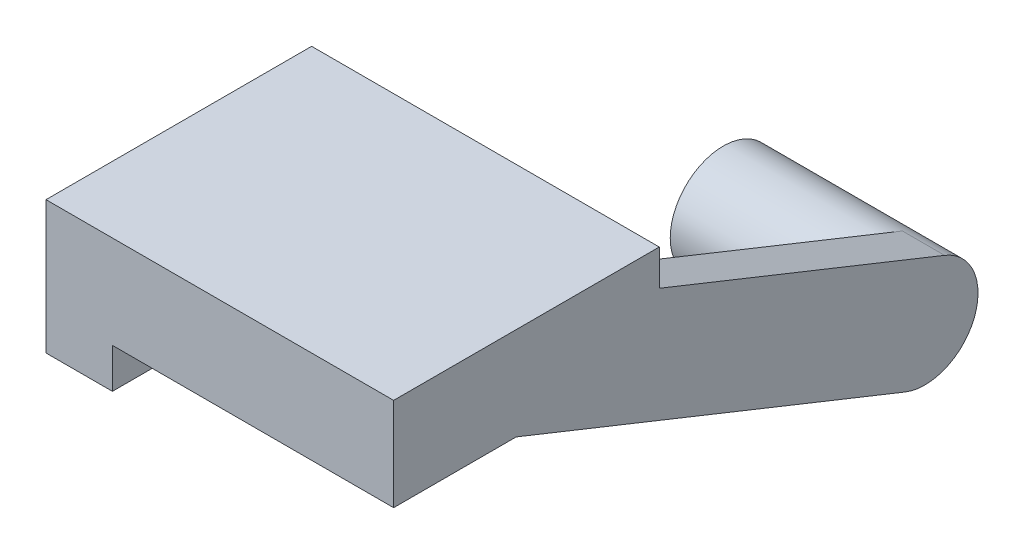
ISO-10303-21;
HEADER;
FILE_DESCRIPTION(('STEP AP214'),'2;1');
FILE_NAME('part.step','',(''),(''),'','','');
FILE_SCHEMA(('AUTOMOTIVE_DESIGN { 1 0 10303 214 1 1 1 1 }'));
ENDSEC;
DATA;
#1=APPLICATION_CONTEXT('core data for automotive mechanical design processes');
#2=APPLICATION_PROTOCOL_DEFINITION('international standard','automotive_design',2000,#1);
#3=PRODUCT_CONTEXT('',#1,'mechanical');
#4=PRODUCT('Part','Part','',(#3));
#5=PRODUCT_RELATED_PRODUCT_CATEGORY('part','',(#4));
#6=PRODUCT_DEFINITION_FORMATION('','',#4);
#7=PRODUCT_DEFINITION_CONTEXT('part definition',#1,'design');
#8=PRODUCT_DEFINITION('design','',#6,#7);
#9=PRODUCT_DEFINITION_SHAPE('','',#8);
#10=(LENGTH_UNIT() NAMED_UNIT(*) SI_UNIT(.MILLI.,.METRE.));
#11=(NAMED_UNIT(*) PLANE_ANGLE_UNIT() SI_UNIT($,.RADIAN.));
#12=(NAMED_UNIT(*) SI_UNIT($,.STERADIAN.) SOLID_ANGLE_UNIT());
#13=UNCERTAINTY_MEASURE_WITH_UNIT(LENGTH_MEASURE(1.E-05),#10,'distance_accuracy_value','');
#14=(GEOMETRIC_REPRESENTATION_CONTEXT(3) GLOBAL_UNCERTAINTY_ASSIGNED_CONTEXT((#13)) GLOBAL_UNIT_ASSIGNED_CONTEXT((#10,
#11,#12)) REPRESENTATION_CONTEXT('',''));
#15=CARTESIAN_POINT('',(0.,0.,0.));
#16=DIRECTION('',(0.,0.,1.));
#17=DIRECTION('',(1.,0.,0.));
#18=AXIS2_PLACEMENT_3D('',#15,#16,#17);
#19=CARTESIAN_POINT('',(23.,0.,0.));
#20=DIRECTION('',(1.,0.,0.));
#21=DIRECTION('',(0.,0.,-1.));
#22=AXIS2_PLACEMENT_3D('',#19,#20,#21);
#23=PLANE('',#22);
#24=CARTESIAN_POINT('',(23.,-9.99999999999999,-30.));
#25=DIRECTION('',(-1.,0.,0.));
#26=DIRECTION('',(0.,0.,1.));
#27=AXIS2_PLACEMENT_3D('',#24,#25,#26);
#28=CIRCLE('',#27,4.);
#29=CARTESIAN_POINT('',(23.,-13.713906763541,-28.5144372945836));
#30=VERTEX_POINT('',#29);
#31=CARTESIAN_POINT('',(23.,-6.28609323645896,-31.4855627054164));
#32=VERTEX_POINT('',#31);
#33=EDGE_CURVE('E143',#30,#32,#28,.T.);
#34=ORIENTED_EDGE('',*,*,#33,.F.);
#35=DIRECTION('',(0.,0.371390676354104,0.928476690885259));
#36=VECTOR('',#35,1.);
#37=CARTESIAN_POINT('',(23.,-1.98976883250655,0.79590753300262));
#38=LINE('',#37,#36);
#39=CARTESIAN_POINT('',(23.,-2.,0.770329614269001));
#40=VERTEX_POINT('',#39);
#41=EDGE_CURVE('E146',#30,#40,#38,.T.);
#42=ORIENTED_EDGE('',*,*,#41,.T.);
#43=DIRECTION('',(0.,0.,-1.));
#44=VECTOR('',#43,1.);
#45=CARTESIAN_POINT('',(23.,-2.,10.));
#46=LINE('',#45,#44);
#47=CARTESIAN_POINT('',(23.,-2.,-10.));
#48=VERTEX_POINT('',#47);
#49=EDGE_CURVE('E74',#40,#48,#46,.T.);
#50=ORIENTED_EDGE('',*,*,#49,.T.);
#51=DIRECTION('',(0.,1.,0.));
#52=VECTOR('',#51,1.);
#53=CARTESIAN_POINT('',(23.,5.,-10.));
#54=LINE('',#53,#52);
#55=CARTESIAN_POINT('',(23.,2.30813184570761,-10.));
#56=VERTEX_POINT('',#55);
#57=EDGE_CURVE('E64',#48,#56,#54,.T.);
#58=ORIENTED_EDGE('',*,*,#57,.T.);
#59=DIRECTION('',(0.,0.371390676354106,0.928476690885259));
#60=VECTOR('',#59,1.);
#61=CARTESIAN_POINT('',(23.,5.43804469457554,-2.17521787783023));
#62=LINE('',#61,#60);
#63=EDGE_CURVE('E147',#32,#56,#62,.T.);
#64=ORIENTED_EDGE('',*,*,#63,.F.);
#65=EDGE_LOOP('',(#34,#42,#50,#58,#64));
#66=FACE_BOUND('',#65,.T.);
#67=ADVANCED_FACE('F45',(#66),#23,.F.);
#68=CARTESIAN_POINT('',(5.,0.,0.));
#69=DIRECTION('',(-1.,0.,0.));
#70=DIRECTION('',(0.,0.,1.));
#71=AXIS2_PLACEMENT_3D('',#68,#69,#70);
#72=PLANE('',#71);
#73=DIRECTION('',(0.,0.,-1.));
#74=VECTOR('',#73,1.);
#75=CARTESIAN_POINT('',(5.,-2.,10.));
#76=LINE('',#75,#74);
#77=CARTESIAN_POINT('',(5.,-2.,10.));
#78=VERTEX_POINT('',#77);
#79=CARTESIAN_POINT('',(5.,-2.,-10.));
#80=VERTEX_POINT('',#79);
#81=EDGE_CURVE('E163',#78,#80,#76,.T.);
#82=ORIENTED_EDGE('',*,*,#81,.F.);
#83=DIRECTION('',(0.,-1.,0.));
#84=VECTOR('',#83,1.);
#85=CARTESIAN_POINT('',(5.,-5.,10.));
#86=LINE('',#85,#84);
#87=CARTESIAN_POINT('',(5.,-5.,10.));
#88=VERTEX_POINT('',#87);
#89=EDGE_CURVE('E224',#78,#88,#86,.T.);
#90=ORIENTED_EDGE('',*,*,#89,.T.);
#91=DIRECTION('',(0.,0.,-1.));
#92=VECTOR('',#91,1.);
#93=CARTESIAN_POINT('',(5.,-5.,10.));
#94=LINE('',#93,#92);
#95=CARTESIAN_POINT('',(5.,-5.,-10.));
#96=VERTEX_POINT('',#95);
#97=EDGE_CURVE('E228',#88,#96,#94,.T.);
#98=ORIENTED_EDGE('',*,*,#97,.T.);
#99=DIRECTION('',(0.,1.,0.));
#100=VECTOR('',#99,1.);
#101=CARTESIAN_POINT('',(5.,-5.,-10.));
#102=LINE('',#101,#100);
#103=EDGE_CURVE('E221',#96,#80,#102,.T.);
#104=ORIENTED_EDGE('',*,*,#103,.T.);
#105=EDGE_LOOP('',(#82,#90,#98,#104));
#106=FACE_BOUND('',#105,.T.);
#107=ADVANCED_FACE('F273',(#106),#72,.F.);
#108=CARTESIAN_POINT('',(0.,0.,0.));
#109=DIRECTION('',(-1.,0.,0.));
#110=DIRECTION('',(0.,0.,1.));
#111=AXIS2_PLACEMENT_3D('',#108,#109,#110);
#112=PLANE('',#111);
#113=CARTESIAN_POINT('',(0.,0.,5.));
#114=DIRECTION('',(1.,0.,0.));
#115=DIRECTION('',(0.,0.,-1.));
#116=AXIS2_PLACEMENT_3D('',#113,#114,#115);
#117=CIRCLE('',#116,1.65);
#118=CARTESIAN_POINT('',(0.,0.,3.35));
#119=VERTEX_POINT('',#118);
#120=EDGE_CURVE('E213',#119,#119,#117,.T.);
#121=ORIENTED_EDGE('',*,*,#120,.T.);
#122=EDGE_LOOP('',(#121));
#123=FACE_BOUND('',#122,.T.);
#124=DIRECTION('',(0.,1.,0.));
#125=VECTOR('',#124,1.);
#126=CARTESIAN_POINT('',(0.,-5.,-10.));
#127=LINE('',#126,#125);
#128=CARTESIAN_POINT('',(0.,-5.,-10.));
#129=VERTEX_POINT('',#128);
#130=CARTESIAN_POINT('',(0.,5.,-10.));
#131=VERTEX_POINT('',#130);
#132=EDGE_CURVE('E220',#129,#131,#127,.T.);
#133=ORIENTED_EDGE('',*,*,#132,.F.);
#134=DIRECTION('',(0.,0.,-1.));
#135=VECTOR('',#134,1.);
#136=CARTESIAN_POINT('',(0.,-5.,10.));
#137=LINE('',#136,#135);
#138=CARTESIAN_POINT('',(0.,-5.,10.));
#139=VERTEX_POINT('',#138);
#140=EDGE_CURVE('E225',#139,#129,#137,.T.);
#141=ORIENTED_EDGE('',*,*,#140,.F.);
#142=DIRECTION('',(0.,-1.,0.));
#143=VECTOR('',#142,1.);
#144=CARTESIAN_POINT('',(0.,-5.,10.));
#145=LINE('',#144,#143);
#146=CARTESIAN_POINT('',(0.,5.,10.));
#147=VERTEX_POINT('',#146);
#148=EDGE_CURVE('E238',#147,#139,#145,.T.);
#149=ORIENTED_EDGE('',*,*,#148,.F.);
#150=DIRECTION('',(0.,0.,1.));
#151=VECTOR('',#150,1.);
#152=CARTESIAN_POINT('',(0.,5.,10.));
#153=LINE('',#152,#151);
#154=EDGE_CURVE('E235',#131,#147,#153,.T.);
#155=ORIENTED_EDGE('',*,*,#154,.F.);
#156=EDGE_LOOP('',(#133,#141,#149,#155));
#157=FACE_BOUND('',#156,.T.);
#158=CARTESIAN_POINT('',(0.,0.,-5.));
#159=DIRECTION('',(1.,0.,0.));
#160=DIRECTION('',(0.,0.,-1.));
#161=AXIS2_PLACEMENT_3D('',#158,#159,#160);
#162=CIRCLE('',#161,1.65);
#163=CARTESIAN_POINT('',(0.,0.,-6.65));
#164=VERTEX_POINT('',#163);
#165=EDGE_CURVE('E209',#164,#164,#162,.T.);
#166=ORIENTED_EDGE('',*,*,#165,.T.);
#167=EDGE_LOOP('',(#166));
#168=FACE_BOUND('',#167,.T.);
#169=ADVANCED_FACE('F264',(#123,#157,#168),#112,.T.);
#170=CARTESIAN_POINT('',(5.,-5.,-10.));
#171=DIRECTION('',(0.,0.,1.));
#172=DIRECTION('',(1.,0.,0.));
#173=AXIS2_PLACEMENT_3D('',#170,#171,#172);
#174=PLANE('',#173);
#175=ORIENTED_EDGE('',*,*,#132,.T.);
#176=DIRECTION('',(-1.,0.,0.));
#177=VECTOR('',#176,1.);
#178=CARTESIAN_POINT('',(5.,5.,-10.));
#179=LINE('',#178,#177);
#180=CARTESIAN_POINT('',(26.175,5.,-10.));
#181=VERTEX_POINT('',#180);
#182=EDGE_CURVE('E11',#181,#131,#179,.T.);
#183=ORIENTED_EDGE('',*,*,#182,.F.);
#184=DIRECTION('',(0.,1.,0.));
#185=VECTOR('',#184,1.);
#186=CARTESIAN_POINT('',(26.175,0.,-10.));
#187=LINE('',#186,#185);
#188=CARTESIAN_POINT('',(26.175,2.30813184570761,-10.));
#189=VERTEX_POINT('',#188);
#190=EDGE_CURVE('E284',#189,#181,#187,.T.);
#191=ORIENTED_EDGE('',*,*,#190,.F.);
#192=DIRECTION('',(-1.,0.,0.));
#193=VECTOR('',#192,1.);
#194=CARTESIAN_POINT('',(26.175,2.30813184570761,-10.));
#195=LINE('',#194,#193);
#196=EDGE_CURVE('E183',#189,#56,#195,.T.);
#197=ORIENTED_EDGE('',*,*,#196,.T.);
#198=ORIENTED_EDGE('',*,*,#57,.F.);
#199=DIRECTION('',(-1.,0.,0.));
#200=VECTOR('',#199,1.);
#201=CARTESIAN_POINT('',(23.,-2.,-10.));
#202=LINE('',#201,#200);
#203=EDGE_CURVE('E193',#48,#80,#202,.T.);
#204=ORIENTED_EDGE('',*,*,#203,.T.);
#205=ORIENTED_EDGE('',*,*,#103,.F.);
#206=DIRECTION('',(-1.,0.,0.));
#207=VECTOR('',#206,1.);
#208=CARTESIAN_POINT('',(5.,-5.,-10.));
#209=LINE('',#208,#207);
#210=EDGE_CURVE('E231',#96,#129,#209,.T.);
#211=ORIENTED_EDGE('',*,*,#210,.T.);
#212=EDGE_LOOP('',(#175,#183,#191,#197,#198,#204,#205,#211));
#213=FACE_BOUND('',#212,.T.);
#214=ADVANCED_FACE('F47',(#213),#174,.F.);
#215=CARTESIAN_POINT('',(5.,5.,10.));
#216=DIRECTION('',(0.,-1.,0.));
#217=DIRECTION('',(0.,0.,-1.));
#218=AXIS2_PLACEMENT_3D('',#215,#216,#217);
#219=PLANE('',#218);
#220=ORIENTED_EDGE('',*,*,#154,.T.);
#221=DIRECTION('',(-1.,0.,0.));
#222=VECTOR('',#221,1.);
#223=CARTESIAN_POINT('',(5.,5.,10.));
#224=LINE('',#223,#222);
#225=CARTESIAN_POINT('',(26.175,5.,10.));
#226=VERTEX_POINT('',#225);
#227=EDGE_CURVE('E54',#226,#147,#224,.T.);
#228=ORIENTED_EDGE('',*,*,#227,.F.);
#229=DIRECTION('',(0.,0.,1.));
#230=VECTOR('',#229,1.);
#231=CARTESIAN_POINT('',(26.175,5.,0.));
#232=LINE('',#231,#230);
#233=EDGE_CURVE('E280',#181,#226,#232,.T.);
#234=ORIENTED_EDGE('',*,*,#233,.F.);
#235=ORIENTED_EDGE('',*,*,#182,.T.);
#236=EDGE_LOOP('',(#220,#228,#234,#235));
#237=FACE_BOUND('',#236,.T.);
#238=ADVANCED_FACE('F299',(#237),#219,.F.);
#239=CARTESIAN_POINT('',(5.,-5.,10.));
#240=DIRECTION('',(0.,0.,-1.));
#241=DIRECTION('',(-1.,0.,0.));
#242=AXIS2_PLACEMENT_3D('',#239,#240,#241);
#243=PLANE('',#242);
#244=ORIENTED_EDGE('',*,*,#148,.T.);
#245=DIRECTION('',(-1.,0.,0.));
#246=VECTOR('',#245,1.);
#247=CARTESIAN_POINT('',(5.,-5.,10.));
#248=LINE('',#247,#246);
#249=EDGE_CURVE('E246',#88,#139,#248,.T.);
#250=ORIENTED_EDGE('',*,*,#249,.F.);
#251=ORIENTED_EDGE('',*,*,#89,.F.);
#252=DIRECTION('',(-1.,0.,0.));
#253=VECTOR('',#252,1.);
#254=CARTESIAN_POINT('',(23.,-2.,10.));
#255=LINE('',#254,#253);
#256=CARTESIAN_POINT('',(26.175,-2.,10.));
#257=VERTEX_POINT('',#256);
#258=EDGE_CURVE('E200',#257,#78,#255,.T.);
#259=ORIENTED_EDGE('',*,*,#258,.F.);
#260=DIRECTION('',(0.,-1.,0.));
#261=VECTOR('',#260,1.);
#262=CARTESIAN_POINT('',(26.175,0.,10.));
#263=LINE('',#262,#261);
#264=EDGE_CURVE('E257',#226,#257,#263,.T.);
#265=ORIENTED_EDGE('',*,*,#264,.F.);
#266=ORIENTED_EDGE('',*,*,#227,.T.);
#267=EDGE_LOOP('',(#244,#250,#251,#259,#265,#266));
#268=FACE_BOUND('',#267,.T.);
#269=ADVANCED_FACE('F254',(#268),#243,.F.);
#270=CARTESIAN_POINT('',(5.,-5.,10.));
#271=DIRECTION('',(0.,1.,0.));
#272=DIRECTION('',(0.,0.,1.));
#273=AXIS2_PLACEMENT_3D('',#270,#271,#272);
#274=PLANE('',#273);
#275=ORIENTED_EDGE('',*,*,#140,.T.);
#276=ORIENTED_EDGE('',*,*,#210,.F.);
#277=ORIENTED_EDGE('',*,*,#97,.F.);
#278=ORIENTED_EDGE('',*,*,#249,.T.);
#279=EDGE_LOOP('',(#275,#276,#277,#278));
#280=FACE_BOUND('',#279,.T.);
#281=ADVANCED_FACE('F268',(#280),#274,.F.);
#282=CARTESIAN_POINT('',(5.,0.,5.));
#283=DIRECTION('',(-1.,0.,0.));
#284=DIRECTION('',(0.,0.,1.));
#285=AXIS2_PLACEMENT_3D('',#282,#283,#284);
#286=CYLINDRICAL_SURFACE('',#285,1.65);
#287=CARTESIAN_POINT('',(5.,0.,5.));
#288=DIRECTION('',(1.,0.,0.));
#289=DIRECTION('',(0.,0.,-1.));
#290=AXIS2_PLACEMENT_3D('',#287,#288,#289);
#291=CIRCLE('',#290,1.65);
#292=CARTESIAN_POINT('',(5.,0.,3.35));
#293=VERTEX_POINT('',#292);
#294=EDGE_CURVE('E208',#293,#293,#291,.T.);
#295=ORIENTED_EDGE('',*,*,#294,.T.);
#296=EDGE_LOOP('',(#295));
#297=FACE_BOUND('',#296,.T.);
#298=ORIENTED_EDGE('',*,*,#120,.F.);
#299=EDGE_LOOP('',(#298));
#300=FACE_BOUND('',#299,.T.);
#301=ADVANCED_FACE('F331',(#297,#300),#286,.F.);
#302=CARTESIAN_POINT('',(5.,0.,-5.));
#303=DIRECTION('',(-1.,0.,0.));
#304=DIRECTION('',(0.,0.,1.));
#305=AXIS2_PLACEMENT_3D('',#302,#303,#304);
#306=CYLINDRICAL_SURFACE('',#305,1.65);
#307=CARTESIAN_POINT('',(5.,0.,-5.));
#308=DIRECTION('',(1.,0.,0.));
#309=DIRECTION('',(0.,0.,-1.));
#310=AXIS2_PLACEMENT_3D('',#307,#308,#309);
#311=CIRCLE('',#310,1.65);
#312=CARTESIAN_POINT('',(5.,0.,-6.65));
#313=VERTEX_POINT('',#312);
#314=EDGE_CURVE('E204',#313,#313,#311,.T.);
#315=ORIENTED_EDGE('',*,*,#314,.T.);
#316=EDGE_LOOP('',(#315));
#317=FACE_BOUND('',#316,.T.);
#318=ORIENTED_EDGE('',*,*,#165,.F.);
#319=EDGE_LOOP('',(#318));
#320=FACE_BOUND('',#319,.T.);
#321=ADVANCED_FACE('F328',(#317,#320),#306,.F.);
#322=CARTESIAN_POINT('',(23.,-2.,10.));
#323=DIRECTION('',(0.,1.,0.));
#324=DIRECTION('',(0.,0.,1.));
#325=AXIS2_PLACEMENT_3D('',#322,#323,#324);
#326=PLANE('',#325);
#327=ORIENTED_EDGE('',*,*,#81,.T.);
#328=ORIENTED_EDGE('',*,*,#203,.F.);
#329=ORIENTED_EDGE('',*,*,#49,.F.);
#330=DIRECTION('',(-1.,0.,0.));
#331=VECTOR('',#330,1.);
#332=CARTESIAN_POINT('',(26.175,-2.,0.770329614269002));
#333=LINE('',#332,#331);
#334=CARTESIAN_POINT('',(26.175,-2.,0.770329614269002));
#335=VERTEX_POINT('',#334);
#336=EDGE_CURVE('E167',#335,#40,#333,.T.);
#337=ORIENTED_EDGE('',*,*,#336,.F.);
#338=DIRECTION('',(0.,0.,-1.));
#339=VECTOR('',#338,1.);
#340=CARTESIAN_POINT('',(26.175,-2.,0.));
#341=LINE('',#340,#339);
#342=EDGE_CURVE('E179',#257,#335,#341,.T.);
#343=ORIENTED_EDGE('',*,*,#342,.F.);
#344=ORIENTED_EDGE('',*,*,#258,.T.);
#345=EDGE_LOOP('',(#327,#328,#329,#337,#343,#344));
#346=FACE_BOUND('',#345,.T.);
#347=ADVANCED_FACE('F275',(#346),#326,.F.);
#348=CARTESIAN_POINT('',(5.,0.,0.));
#349=DIRECTION('',(1.,0.,0.));
#350=DIRECTION('',(0.,0.,-1.));
#351=AXIS2_PLACEMENT_3D('',#348,#349,#350);
#352=PLANE('',#351);
#353=ORIENTED_EDGE('',*,*,#314,.F.);
#354=EDGE_LOOP('',(#353));
#355=FACE_BOUND('',#354,.T.);
#356=ADVANCED_FACE('F322',(#355),#352,.F.);
#357=ORIENTED_EDGE('',*,*,#294,.F.);
#358=EDGE_LOOP('',(#357));
#359=FACE_BOUND('',#358,.T.);
#360=ADVANCED_FACE('F321',(#359),#352,.F.);
#361=CARTESIAN_POINT('',(26.175,-1.98976883250655,0.79590753300262));
#362=DIRECTION('',(0.,-0.928476690885259,0.371390676354104));
#363=DIRECTION('',(0.,-0.371390676354104,-0.92847669088526));
#364=AXIS2_PLACEMENT_3D('',#361,#362,#363);
#365=PLANE('',#364);
#366=ORIENTED_EDGE('',*,*,#41,.F.);
#367=DIRECTION('',(-1.,0.,0.));
#368=VECTOR('',#367,1.);
#369=CARTESIAN_POINT('',(26.175,-13.713906763541,-28.5144372945836));
#370=LINE('',#369,#368);
#371=CARTESIAN_POINT('',(26.175,-13.713906763541,-28.5144372945836));
#372=VERTEX_POINT('',#371);
#373=EDGE_CURVE('E155',#372,#30,#370,.T.);
#374=ORIENTED_EDGE('',*,*,#373,.F.);
#375=DIRECTION('',(0.,0.371390676354104,0.928476690885259));
#376=VECTOR('',#375,1.);
#377=CARTESIAN_POINT('',(26.175,-1.98976883250655,0.79590753300262));
#378=LINE('',#377,#376);
#379=EDGE_CURVE('E173',#372,#335,#378,.T.);
#380=ORIENTED_EDGE('',*,*,#379,.T.);
#381=ORIENTED_EDGE('',*,*,#336,.T.);
#382=EDGE_LOOP('',(#366,#374,#380,#381));
#383=FACE_BOUND('',#382,.T.);
#384=ADVANCED_FACE('F166',(#383),#365,.T.);
#385=CARTESIAN_POINT('',(26.175,-9.99999999999999,-30.));
#386=DIRECTION('',(-1.,0.,0.));
#387=DIRECTION('',(0.,0.,1.));
#388=AXIS2_PLACEMENT_3D('',#385,#386,#387);
#389=CYLINDRICAL_SURFACE('',#388,4.);
#390=ORIENTED_EDGE('',*,*,#373,.T.);
#391=ORIENTED_EDGE('',*,*,#33,.T.);
#392=DIRECTION('',(-1.,0.,0.));
#393=VECTOR('',#392,1.);
#394=CARTESIAN_POINT('',(26.175,-6.28609323645896,-31.4855627054164));
#395=LINE('',#394,#393);
#396=CARTESIAN_POINT('',(26.175,-6.28609323645896,-31.4855627054164));
#397=VERTEX_POINT('',#396);
#398=EDGE_CURVE('E164',#397,#32,#395,.T.);
#399=ORIENTED_EDGE('',*,*,#398,.F.);
#400=CARTESIAN_POINT('',(26.175,-9.99999999999999,-30.));
#401=DIRECTION('',(1.,0.,0.));
#402=DIRECTION('',(0.,0.,-1.));
#403=AXIS2_PLACEMENT_3D('',#400,#401,#402);
#404=CIRCLE('',#403,4.);
#405=EDGE_CURVE('E158',#372,#397,#404,.T.);
#406=ORIENTED_EDGE('',*,*,#405,.F.);
#407=EDGE_LOOP('',(#390,#391,#399,#406));
#408=FACE_BOUND('',#407,.T.);
#409=CARTESIAN_POINT('',(11.,-9.99999999999999,-30.));
#410=DIRECTION('',(-1.,0.,0.));
#411=DIRECTION('',(0.,0.,1.));
#412=AXIS2_PLACEMENT_3D('',#409,#410,#411);
#413=CIRCLE('',#412,4.);
#414=CARTESIAN_POINT('',(11.,-9.99999999999999,-26.));
#415=VERTEX_POINT('',#414);
#416=EDGE_CURVE('E152',#415,#415,#413,.T.);
#417=ORIENTED_EDGE('',*,*,#416,.F.);
#418=EDGE_LOOP('',(#417));
#419=FACE_BOUND('',#418,.T.);
#420=ADVANCED_FACE('F156',(#408,#419),#389,.T.);
#421=CARTESIAN_POINT('',(26.175,5.43804469457554,-2.17521787783023));
#422=DIRECTION('',(0.,-0.928476690885258,0.371390676354106));
#423=DIRECTION('',(0.,-0.371390676354106,-0.928476690885259));
#424=AXIS2_PLACEMENT_3D('',#421,#422,#423);
#425=PLANE('',#424);
#426=ORIENTED_EDGE('',*,*,#63,.T.);
#427=ORIENTED_EDGE('',*,*,#196,.F.);
#428=DIRECTION('',(0.,0.371390676354106,0.928476690885259));
#429=VECTOR('',#428,1.);
#430=CARTESIAN_POINT('',(26.175,5.43804469457554,-2.17521787783023));
#431=LINE('',#430,#429);
#432=EDGE_CURVE('E289',#397,#189,#431,.T.);
#433=ORIENTED_EDGE('',*,*,#432,.F.);
#434=ORIENTED_EDGE('',*,*,#398,.T.);
#435=EDGE_LOOP('',(#426,#427,#433,#434));
#436=FACE_BOUND('',#435,.T.);
#437=ADVANCED_FACE('F297',(#436),#425,.F.);
#438=CARTESIAN_POINT('',(26.175,0.,0.));
#439=DIRECTION('',(1.,0.,0.));
#440=DIRECTION('',(0.,0.,-1.));
#441=AXIS2_PLACEMENT_3D('',#438,#439,#440);
#442=PLANE('',#441);
#443=ORIENTED_EDGE('',*,*,#379,.F.);
#444=ORIENTED_EDGE('',*,*,#405,.T.);
#445=ORIENTED_EDGE('',*,*,#432,.T.);
#446=ORIENTED_EDGE('',*,*,#190,.T.);
#447=ORIENTED_EDGE('',*,*,#233,.T.);
#448=ORIENTED_EDGE('',*,*,#264,.T.);
#449=ORIENTED_EDGE('',*,*,#342,.T.);
#450=EDGE_LOOP('',(#443,#444,#445,#446,#447,#448,#449));
#451=FACE_BOUND('',#450,.T.);
#452=ADVANCED_FACE('F278',(#451),#442,.T.);
#453=CARTESIAN_POINT('',(11.,-9.99999999999999,-30.));
#454=DIRECTION('',(-1.,0.,0.));
#455=DIRECTION('',(0.,0.,1.));
#456=AXIS2_PLACEMENT_3D('',#453,#454,#455);
#457=PLANE('',#456);
#458=ORIENTED_EDGE('',*,*,#416,.T.);
#459=EDGE_LOOP('',(#458));
#460=FACE_BOUND('',#459,.T.);
#461=ADVANCED_FACE('F387',(#460),#457,.T.);
#462=CLOSED_SHELL('',(#67,#107,#169,#214,#238,#269,#281,#301,#321,#347,#356,#360,#384,#420,#437,
#452,#461));
#463=MANIFOLD_SOLID_BREP('B2',#462);
#464=ADVANCED_BREP_SHAPE_REPRESENTATION('',(#18,#463),#14);
#465=SHAPE_DEFINITION_REPRESENTATION(#9,#464);
ENDSEC;
END-ISO-10303-21;
